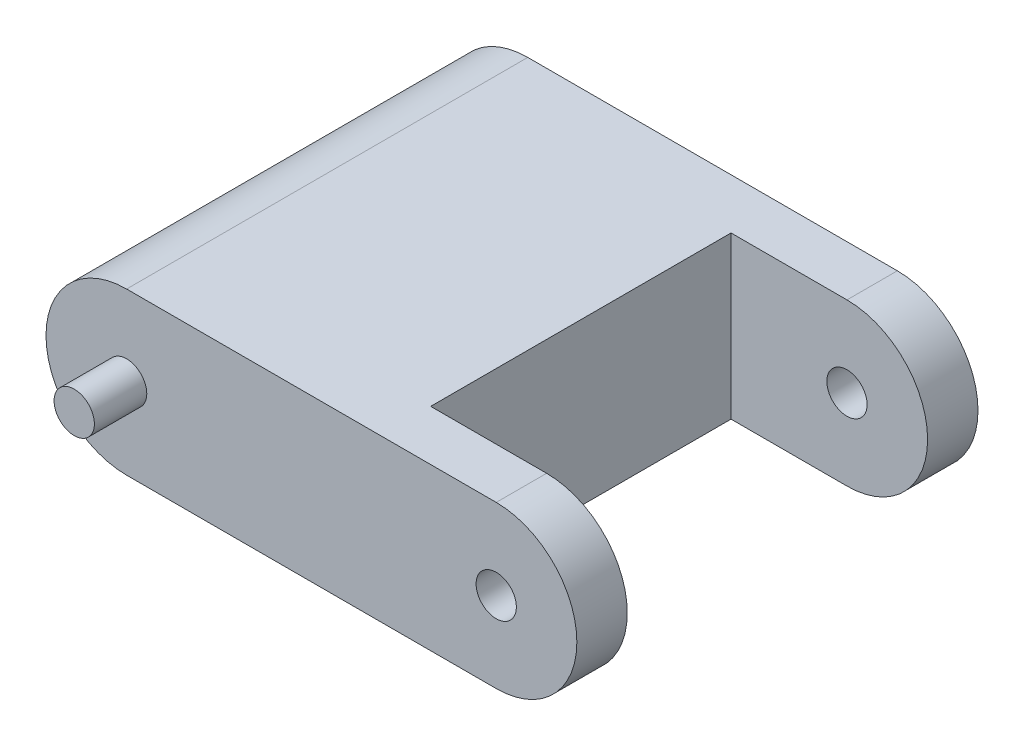
ISO-10303-21;
HEADER;
FILE_DESCRIPTION(('STEP AP214'),'2;1');
FILE_NAME('part.step','',(''),(''),'','','');
FILE_SCHEMA(('AUTOMOTIVE_DESIGN { 1 0 10303 214 1 1 1 1 }'));
ENDSEC;
DATA;
#1=APPLICATION_CONTEXT('core data for automotive mechanical design processes');
#2=APPLICATION_PROTOCOL_DEFINITION('international standard','automotive_design',2000,#1);
#3=PRODUCT_CONTEXT('',#1,'mechanical');
#4=PRODUCT('Part','Part','',(#3));
#5=PRODUCT_RELATED_PRODUCT_CATEGORY('part','',(#4));
#6=PRODUCT_DEFINITION_FORMATION('','',#4);
#7=PRODUCT_DEFINITION_CONTEXT('part definition',#1,'design');
#8=PRODUCT_DEFINITION('design','',#6,#7);
#9=PRODUCT_DEFINITION_SHAPE('','',#8);
#10=(LENGTH_UNIT() NAMED_UNIT(*) SI_UNIT(.MILLI.,.METRE.));
#11=(NAMED_UNIT(*) PLANE_ANGLE_UNIT() SI_UNIT($,.RADIAN.));
#12=(NAMED_UNIT(*) SI_UNIT($,.STERADIAN.) SOLID_ANGLE_UNIT());
#13=UNCERTAINTY_MEASURE_WITH_UNIT(LENGTH_MEASURE(1.E-05),#10,'distance_accuracy_value','');
#14=(GEOMETRIC_REPRESENTATION_CONTEXT(3) GLOBAL_UNCERTAINTY_ASSIGNED_CONTEXT((#13)) GLOBAL_UNIT_ASSIGNED_CONTEXT((#10,
#11,#12)) REPRESENTATION_CONTEXT('',''));
#15=CARTESIAN_POINT('',(0.,0.,0.));
#16=DIRECTION('',(0.,0.,1.));
#17=DIRECTION('',(1.,0.,0.));
#18=AXIS2_PLACEMENT_3D('',#15,#16,#17);
#19=CARTESIAN_POINT('',(183.351967945851,0.,199.));
#20=DIRECTION('',(0.,0.,-1.));
#21=DIRECTION('',(-1.,0.,0.));
#22=AXIS2_PLACEMENT_3D('',#19,#20,#21);
#23=CYLINDRICAL_SURFACE('',#22,40.);
#24=DIRECTION('',(0.,0.,-1.));
#25=VECTOR('',#24,1.);
#26=CARTESIAN_POINT('',(183.351967945851,-40.,199.));
#27=LINE('',#26,#25);
#28=CARTESIAN_POINT('',(183.351967945851,-40.,199.));
#29=VERTEX_POINT('',#28);
#30=CARTESIAN_POINT('',(183.351967945851,-40.,174.));
#31=VERTEX_POINT('',#30);
#32=EDGE_CURVE('E178',#29,#31,#27,.T.);
#33=ORIENTED_EDGE('',*,*,#32,.T.);
#34=CARTESIAN_POINT('',(183.351967945851,0.,174.));
#35=DIRECTION('',(0.,0.,1.));
#36=DIRECTION('',(1.,0.,0.));
#37=AXIS2_PLACEMENT_3D('',#34,#35,#36);
#38=CIRCLE('',#37,40.);
#39=CARTESIAN_POINT('',(183.351967945851,40.,174.));
#40=VERTEX_POINT('',#39);
#41=EDGE_CURVE('E136',#31,#40,#38,.T.);
#42=ORIENTED_EDGE('',*,*,#41,.T.);
#43=DIRECTION('',(0.,0.,-1.));
#44=VECTOR('',#43,1.);
#45=CARTESIAN_POINT('',(183.351967945851,40.,199.));
#46=LINE('',#45,#44);
#47=CARTESIAN_POINT('',(183.351967945851,40.,199.));
#48=VERTEX_POINT('',#47);
#49=EDGE_CURVE('E175',#48,#40,#46,.T.);
#50=ORIENTED_EDGE('',*,*,#49,.F.);
#51=CARTESIAN_POINT('',(183.351967945851,0.,199.));
#52=DIRECTION('',(0.,0.,1.));
#53=DIRECTION('',(1.,0.,0.));
#54=AXIS2_PLACEMENT_3D('',#51,#52,#53);
#55=CIRCLE('',#54,40.);
#56=EDGE_CURVE('E160',#29,#48,#55,.T.);
#57=ORIENTED_EDGE('',*,*,#56,.F.);
#58=EDGE_LOOP('',(#33,#42,#50,#57));
#59=FACE_BOUND('',#58,.T.);
#60=ADVANCED_FACE('F33',(#59),#23,.T.);
#61=CARTESIAN_POINT('',(183.351967945851,0.,240.));
#62=DIRECTION('',(0.,0.,-1.));
#63=DIRECTION('',(-1.,0.,0.));
#64=AXIS2_PLACEMENT_3D('',#61,#62,#63);
#65=CYLINDRICAL_SURFACE('',#64,9.98799999999999);
#66=CARTESIAN_POINT('',(183.351967945851,0.,174.));
#67=DIRECTION('',(0.,0.,1.));
#68=DIRECTION('',(1.,0.,0.));
#69=AXIS2_PLACEMENT_3D('',#66,#67,#68);
#70=CIRCLE('',#69,9.98799999999999);
#71=CARTESIAN_POINT('',(193.339967945851,0.,174.));
#72=VERTEX_POINT('',#71);
#73=EDGE_CURVE('E37',#72,#72,#70,.F.);
#74=ORIENTED_EDGE('',*,*,#73,.T.);
#75=EDGE_LOOP('',(#74));
#76=FACE_BOUND('',#75,.T.);
#77=CARTESIAN_POINT('',(183.351967945851,0.,199.));
#78=DIRECTION('',(0.,0.,1.));
#79=DIRECTION('',(1.,0.,0.));
#80=AXIS2_PLACEMENT_3D('',#77,#78,#79);
#81=CIRCLE('',#80,9.98799999999999);
#82=CARTESIAN_POINT('',(193.339967945851,0.,199.));
#83=VERTEX_POINT('',#82);
#84=EDGE_CURVE('E153',#83,#83,#81,.T.);
#85=ORIENTED_EDGE('',*,*,#84,.T.);
#86=EDGE_LOOP('',(#85));
#87=FACE_BOUND('',#86,.T.);
#88=ADVANCED_FACE('F200',(#76,#87),#65,.F.);
#89=CARTESIAN_POINT('',(0.,0.,199.));
#90=DIRECTION('',(0.,0.,-1.));
#91=DIRECTION('',(-1.,0.,0.));
#92=AXIS2_PLACEMENT_3D('',#89,#90,#91);
#93=CYLINDRICAL_SURFACE('',#92,40.);
#94=CARTESIAN_POINT('',(0.,0.,0.));
#95=DIRECTION('',(0.,0.,1.));
#96=DIRECTION('',(1.,0.,0.));
#97=AXIS2_PLACEMENT_3D('',#94,#95,#96);
#98=CIRCLE('',#97,40.);
#99=CARTESIAN_POINT('',(0.,40.,0.));
#100=VERTEX_POINT('',#99);
#101=CARTESIAN_POINT('',(0.,-40.,0.));
#102=VERTEX_POINT('',#101);
#103=EDGE_CURVE('E156',#100,#102,#98,.T.);
#104=ORIENTED_EDGE('',*,*,#103,.T.);
#105=DIRECTION('',(0.,0.,-1.));
#106=VECTOR('',#105,1.);
#107=CARTESIAN_POINT('',(0.,-40.,199.));
#108=LINE('',#107,#106);
#109=CARTESIAN_POINT('',(0.,-40.,199.));
#110=VERTEX_POINT('',#109);
#111=EDGE_CURVE('E42',#110,#102,#108,.T.);
#112=ORIENTED_EDGE('',*,*,#111,.F.);
#113=CARTESIAN_POINT('',(0.,0.,199.));
#114=DIRECTION('',(0.,0.,1.));
#115=DIRECTION('',(1.,0.,0.));
#116=AXIS2_PLACEMENT_3D('',#113,#114,#115);
#117=CIRCLE('',#116,40.);
#118=CARTESIAN_POINT('',(0.,40.,199.));
#119=VERTEX_POINT('',#118);
#120=EDGE_CURVE('E157',#119,#110,#117,.T.);
#121=ORIENTED_EDGE('',*,*,#120,.F.);
#122=DIRECTION('',(0.,0.,-1.));
#123=VECTOR('',#122,1.);
#124=CARTESIAN_POINT('',(0.,40.,199.));
#125=LINE('',#124,#123);
#126=EDGE_CURVE('E163',#119,#100,#125,.T.);
#127=ORIENTED_EDGE('',*,*,#126,.T.);
#128=EDGE_LOOP('',(#104,#112,#121,#127));
#129=FACE_BOUND('',#128,.T.);
#130=ADVANCED_FACE('F35',(#129),#93,.T.);
#131=CARTESIAN_POINT('',(0.,-40.,199.));
#132=DIRECTION('',(0.,1.,0.));
#133=DIRECTION('',(0.,0.,1.));
#134=AXIS2_PLACEMENT_3D('',#131,#132,#133);
#135=PLANE('',#134);
#136=DIRECTION('',(0.,0.,1.));
#137=VECTOR('',#136,1.);
#138=CARTESIAN_POINT('',(125.83524238696,-40.,199.));
#139=LINE('',#138,#137);
#140=CARTESIAN_POINT('',(125.83524238696,-40.,25.));
#141=VERTEX_POINT('',#140);
#142=CARTESIAN_POINT('',(125.83524238696,-40.,174.));
#143=VERTEX_POINT('',#142);
#144=EDGE_CURVE('E117',#141,#143,#139,.T.);
#145=ORIENTED_EDGE('',*,*,#144,.T.);
#146=DIRECTION('',(1.,0.,0.));
#147=VECTOR('',#146,1.);
#148=CARTESIAN_POINT('',(0.,-40.,174.));
#149=LINE('',#148,#147);
#150=EDGE_CURVE('E139',#143,#31,#149,.T.);
#151=ORIENTED_EDGE('',*,*,#150,.T.);
#152=ORIENTED_EDGE('',*,*,#32,.F.);
#153=DIRECTION('',(1.,0.,0.));
#154=VECTOR('',#153,1.);
#155=CARTESIAN_POINT('',(0.,-40.,199.));
#156=LINE('',#155,#154);
#157=EDGE_CURVE('E87',#110,#29,#156,.T.);
#158=ORIENTED_EDGE('',*,*,#157,.F.);
#159=ORIENTED_EDGE('',*,*,#111,.T.);
#160=DIRECTION('',(1.,0.,0.));
#161=VECTOR('',#160,1.);
#162=CARTESIAN_POINT('',(0.,-40.,0.));
#163=LINE('',#162,#161);
#164=CARTESIAN_POINT('',(183.351967945851,-40.,0.));
#165=VERTEX_POINT('',#164);
#166=EDGE_CURVE('E166',#102,#165,#163,.T.);
#167=ORIENTED_EDGE('',*,*,#166,.T.);
#168=CARTESIAN_POINT('',(183.351967945851,-40.,25.));
#169=VERTEX_POINT('',#168);
#170=EDGE_CURVE('E177',#169,#165,#27,.T.);
#171=ORIENTED_EDGE('',*,*,#170,.F.);
#172=DIRECTION('',(-1.,0.,0.));
#173=VECTOR('',#172,1.);
#174=CARTESIAN_POINT('',(0.,-40.,25.));
#175=LINE('',#174,#173);
#176=EDGE_CURVE('E134',#169,#141,#175,.T.);
#177=ORIENTED_EDGE('',*,*,#176,.T.);
#178=EDGE_LOOP('',(#145,#151,#152,#158,#159,#167,#171,#177));
#179=FACE_BOUND('',#178,.T.);
#180=ADVANCED_FACE('F211',(#179),#135,.F.);
#181=CARTESIAN_POINT('',(183.351967945851,40.,25.));
#182=VERTEX_POINT('',#181);
#183=CARTESIAN_POINT('',(183.351967945851,40.,0.));
#184=VERTEX_POINT('',#183);
#185=EDGE_CURVE('E174',#182,#184,#46,.T.);
#186=ORIENTED_EDGE('',*,*,#185,.F.);
#187=CARTESIAN_POINT('',(183.351967945851,0.,25.));
#188=DIRECTION('',(0.,0.,-1.));
#189=DIRECTION('',(-1.,0.,0.));
#190=AXIS2_PLACEMENT_3D('',#187,#188,#189);
#191=CIRCLE('',#190,40.);
#192=EDGE_CURVE('E50',#182,#169,#191,.T.);
#193=ORIENTED_EDGE('',*,*,#192,.T.);
#194=ORIENTED_EDGE('',*,*,#170,.T.);
#195=CARTESIAN_POINT('',(183.351967945851,0.,0.));
#196=DIRECTION('',(0.,0.,1.));
#197=DIRECTION('',(1.,0.,0.));
#198=AXIS2_PLACEMENT_3D('',#195,#196,#197);
#199=CIRCLE('',#198,40.);
#200=EDGE_CURVE('E169',#165,#184,#199,.T.);
#201=ORIENTED_EDGE('',*,*,#200,.T.);
#202=EDGE_LOOP('',(#186,#193,#194,#201));
#203=FACE_BOUND('',#202,.T.);
#204=ADVANCED_FACE('F203',(#203),#23,.T.);
#205=CARTESIAN_POINT('',(0.,40.,199.));
#206=DIRECTION('',(0.,-1.,0.));
#207=DIRECTION('',(0.,0.,-1.));
#208=AXIS2_PLACEMENT_3D('',#205,#206,#207);
#209=PLANE('',#208);
#210=ORIENTED_EDGE('',*,*,#49,.T.);
#211=DIRECTION('',(1.,0.,0.));
#212=VECTOR('',#211,1.);
#213=CARTESIAN_POINT('',(249.482135519451,40.,174.));
#214=LINE('',#213,#212);
#215=CARTESIAN_POINT('',(125.83524238696,40.,174.));
#216=VERTEX_POINT('',#215);
#217=EDGE_CURVE('E120',#216,#40,#214,.T.);
#218=ORIENTED_EDGE('',*,*,#217,.F.);
#219=DIRECTION('',(0.,0.,1.));
#220=VECTOR('',#219,1.);
#221=CARTESIAN_POINT('',(125.83524238696,40.,25.));
#222=LINE('',#221,#220);
#223=CARTESIAN_POINT('',(125.83524238696,40.,25.));
#224=VERTEX_POINT('',#223);
#225=EDGE_CURVE('E114',#224,#216,#222,.T.);
#226=ORIENTED_EDGE('',*,*,#225,.F.);
#227=DIRECTION('',(-1.,0.,0.));
#228=VECTOR('',#227,1.);
#229=CARTESIAN_POINT('',(249.482135519451,40.,25.));
#230=LINE('',#229,#228);
#231=EDGE_CURVE('E122',#182,#224,#230,.T.);
#232=ORIENTED_EDGE('',*,*,#231,.F.);
#233=ORIENTED_EDGE('',*,*,#185,.T.);
#234=DIRECTION('',(-1.,0.,0.));
#235=VECTOR('',#234,1.);
#236=CARTESIAN_POINT('',(0.,40.,0.));
#237=LINE('',#236,#235);
#238=EDGE_CURVE('E79',#184,#100,#237,.T.);
#239=ORIENTED_EDGE('',*,*,#238,.T.);
#240=ORIENTED_EDGE('',*,*,#126,.F.);
#241=DIRECTION('',(-1.,0.,0.));
#242=VECTOR('',#241,1.);
#243=CARTESIAN_POINT('',(0.,40.,199.));
#244=LINE('',#243,#242);
#245=EDGE_CURVE('E59',#48,#119,#244,.T.);
#246=ORIENTED_EDGE('',*,*,#245,.F.);
#247=EDGE_LOOP('',(#210,#218,#226,#232,#233,#239,#240,#246));
#248=FACE_BOUND('',#247,.T.);
#249=ADVANCED_FACE('F127',(#248),#209,.F.);
#250=CARTESIAN_POINT('',(0.,0.,199.));
#251=DIRECTION('',(0.,0.,1.));
#252=DIRECTION('',(1.,0.,0.));
#253=AXIS2_PLACEMENT_3D('',#250,#251,#252);
#254=PLANE('',#253);
#255=CARTESIAN_POINT('',(0.,0.,199.));
#256=DIRECTION('',(0.,0.,1.));
#257=DIRECTION('',(1.,0.,0.));
#258=AXIS2_PLACEMENT_3D('',#255,#256,#257);
#259=CIRCLE('',#258,10.);
#260=CARTESIAN_POINT('',(10.,0.,199.));
#261=VERTEX_POINT('',#260);
#262=EDGE_CURVE('E11',#261,#261,#259,.T.);
#263=ORIENTED_EDGE('',*,*,#262,.F.);
#264=EDGE_LOOP('',(#263));
#265=FACE_BOUND('',#264,.T.);
#266=ORIENTED_EDGE('',*,*,#84,.F.);
#267=EDGE_LOOP('',(#266));
#268=FACE_BOUND('',#267,.T.);
#269=ORIENTED_EDGE('',*,*,#120,.T.);
#270=ORIENTED_EDGE('',*,*,#157,.T.);
#271=ORIENTED_EDGE('',*,*,#56,.T.);
#272=ORIENTED_EDGE('',*,*,#245,.T.);
#273=EDGE_LOOP('',(#269,#270,#271,#272));
#274=FACE_BOUND('',#273,.T.);
#275=ADVANCED_FACE('F217',(#265,#268,#274),#254,.T.);
#276=CARTESIAN_POINT('',(0.,0.,0.));
#277=DIRECTION('',(0.,0.,1.));
#278=DIRECTION('',(1.,0.,0.));
#279=AXIS2_PLACEMENT_3D('',#276,#277,#278);
#280=PLANE('',#279);
#281=CARTESIAN_POINT('',(0.,0.,0.));
#282=DIRECTION('',(0.,0.,1.));
#283=DIRECTION('',(1.,0.,0.));
#284=AXIS2_PLACEMENT_3D('',#281,#282,#283);
#285=CIRCLE('',#284,10.);
#286=CARTESIAN_POINT('',(10.,0.,0.));
#287=VERTEX_POINT('',#286);
#288=EDGE_CURVE('E148',#287,#287,#285,.T.);
#289=ORIENTED_EDGE('',*,*,#288,.T.);
#290=EDGE_LOOP('',(#289));
#291=FACE_BOUND('',#290,.T.);
#292=CARTESIAN_POINT('',(183.351967945851,0.,0.));
#293=DIRECTION('',(0.,0.,-1.));
#294=DIRECTION('',(-1.,0.,0.));
#295=AXIS2_PLACEMENT_3D('',#292,#293,#294);
#296=CIRCLE('',#295,9.98799999999999);
#297=CARTESIAN_POINT('',(173.363967945851,0.,0.));
#298=VERTEX_POINT('',#297);
#299=EDGE_CURVE('E150',#298,#298,#296,.T.);
#300=ORIENTED_EDGE('',*,*,#299,.F.);
#301=EDGE_LOOP('',(#300));
#302=FACE_BOUND('',#301,.T.);
#303=ORIENTED_EDGE('',*,*,#103,.F.);
#304=ORIENTED_EDGE('',*,*,#238,.F.);
#305=ORIENTED_EDGE('',*,*,#200,.F.);
#306=ORIENTED_EDGE('',*,*,#166,.F.);
#307=EDGE_LOOP('',(#303,#304,#305,#306));
#308=FACE_BOUND('',#307,.T.);
#309=ADVANCED_FACE('F222',(#291,#302,#308),#280,.F.);
#310=CARTESIAN_POINT('',(183.351967945851,0.,25.));
#311=DIRECTION('',(0.,0.,-1.));
#312=DIRECTION('',(-1.,0.,0.));
#313=AXIS2_PLACEMENT_3D('',#310,#311,#312);
#314=CIRCLE('',#313,9.98799999999999);
#315=CARTESIAN_POINT('',(173.363967945851,0.,25.));
#316=VERTEX_POINT('',#315);
#317=EDGE_CURVE('E131',#316,#316,#314,.F.);
#318=ORIENTED_EDGE('',*,*,#317,.T.);
#319=EDGE_LOOP('',(#318));
#320=FACE_BOUND('',#319,.T.);
#321=ORIENTED_EDGE('',*,*,#299,.T.);
#322=EDGE_LOOP('',(#321));
#323=FACE_BOUND('',#322,.T.);
#324=ADVANCED_FACE('F186',(#320,#323),#65,.F.);
#325=CARTESIAN_POINT('',(0.,0.,-26.0000000000002));
#326=DIRECTION('',(0.,0.,1.));
#327=DIRECTION('',(1.,0.,0.));
#328=AXIS2_PLACEMENT_3D('',#325,#326,#327);
#329=PLANE('',#328);
#330=CARTESIAN_POINT('',(0.,0.,-26.0000000000002));
#331=DIRECTION('',(0.,0.,1.));
#332=DIRECTION('',(1.,0.,0.));
#333=AXIS2_PLACEMENT_3D('',#330,#331,#332);
#334=CIRCLE('',#333,10.);
#335=CARTESIAN_POINT('',(10.,0.,-26.0000000000002));
#336=VERTEX_POINT('',#335);
#337=EDGE_CURVE('E146',#336,#336,#334,.T.);
#338=ORIENTED_EDGE('',*,*,#337,.F.);
#339=EDGE_LOOP('',(#338));
#340=FACE_BOUND('',#339,.T.);
#341=ADVANCED_FACE('F241',(#340),#329,.F.);
#342=CARTESIAN_POINT('',(0.,0.,-26.0000000000002));
#343=DIRECTION('',(0.,0.,1.));
#344=DIRECTION('',(1.,0.,0.));
#345=AXIS2_PLACEMENT_3D('',#342,#343,#344);
#346=CYLINDRICAL_SURFACE('',#345,10.);
#347=ORIENTED_EDGE('',*,*,#337,.T.);
#348=EDGE_LOOP('',(#347));
#349=FACE_BOUND('',#348,.T.);
#350=ORIENTED_EDGE('',*,*,#288,.F.);
#351=EDGE_LOOP('',(#350));
#352=FACE_BOUND('',#351,.T.);
#353=ADVANCED_FACE('F246',(#349,#352),#346,.T.);
#354=ORIENTED_EDGE('',*,*,#262,.T.);
#355=EDGE_LOOP('',(#354));
#356=FACE_BOUND('',#355,.T.);
#357=CARTESIAN_POINT('',(0.,0.,225.));
#358=DIRECTION('',(0.,0.,1.));
#359=DIRECTION('',(1.,0.,0.));
#360=AXIS2_PLACEMENT_3D('',#357,#358,#359);
#361=CIRCLE('',#360,10.);
#362=CARTESIAN_POINT('',(10.,0.,225.));
#363=VERTEX_POINT('',#362);
#364=EDGE_CURVE('E143',#363,#363,#361,.T.);
#365=ORIENTED_EDGE('',*,*,#364,.F.);
#366=EDGE_LOOP('',(#365));
#367=FACE_BOUND('',#366,.T.);
#368=ADVANCED_FACE('F242',(#356,#367),#346,.T.);
#369=CARTESIAN_POINT('',(0.,0.,225.));
#370=DIRECTION('',(0.,0.,1.));
#371=DIRECTION('',(1.,0.,0.));
#372=AXIS2_PLACEMENT_3D('',#369,#370,#371);
#373=PLANE('',#372);
#374=ORIENTED_EDGE('',*,*,#364,.T.);
#375=EDGE_LOOP('',(#374));
#376=FACE_BOUND('',#375,.T.);
#377=ADVANCED_FACE('F245',(#376),#373,.T.);
#378=CARTESIAN_POINT('',(125.83524238696,-82.,25.));
#379=DIRECTION('',(-1.,0.,0.));
#380=DIRECTION('',(0.,0.,1.));
#381=AXIS2_PLACEMENT_3D('',#378,#379,#380);
#382=PLANE('',#381);
#383=DIRECTION('',(0.,1.,0.));
#384=VECTOR('',#383,1.);
#385=CARTESIAN_POINT('',(125.83524238696,-82.,25.));
#386=LINE('',#385,#384);
#387=EDGE_CURVE('E110',#141,#224,#386,.T.);
#388=ORIENTED_EDGE('',*,*,#387,.T.);
#389=ORIENTED_EDGE('',*,*,#225,.T.);
#390=DIRECTION('',(0.,1.,0.));
#391=VECTOR('',#390,1.);
#392=CARTESIAN_POINT('',(125.83524238696,-82.,174.));
#393=LINE('',#392,#391);
#394=EDGE_CURVE('E119',#143,#216,#393,.T.);
#395=ORIENTED_EDGE('',*,*,#394,.F.);
#396=ORIENTED_EDGE('',*,*,#144,.F.);
#397=EDGE_LOOP('',(#388,#389,#395,#396));
#398=FACE_BOUND('',#397,.T.);
#399=ADVANCED_FACE('F111',(#398),#382,.F.);
#400=CARTESIAN_POINT('',(249.482135519451,-82.,174.));
#401=DIRECTION('',(0.,0.,1.));
#402=DIRECTION('',(1.,0.,0.));
#403=AXIS2_PLACEMENT_3D('',#400,#401,#402);
#404=PLANE('',#403);
#405=ORIENTED_EDGE('',*,*,#73,.F.);
#406=EDGE_LOOP('',(#405));
#407=FACE_BOUND('',#406,.T.);
#408=ORIENTED_EDGE('',*,*,#394,.T.);
#409=ORIENTED_EDGE('',*,*,#217,.T.);
#410=ORIENTED_EDGE('',*,*,#41,.F.);
#411=ORIENTED_EDGE('',*,*,#150,.F.);
#412=EDGE_LOOP('',(#408,#409,#410,#411));
#413=FACE_BOUND('',#412,.T.);
#414=ADVANCED_FACE('F190',(#407,#413),#404,.F.);
#415=CARTESIAN_POINT('',(249.482135519451,-82.,25.));
#416=DIRECTION('',(0.,0.,-1.));
#417=DIRECTION('',(-1.,0.,0.));
#418=AXIS2_PLACEMENT_3D('',#415,#416,#417);
#419=PLANE('',#418);
#420=ORIENTED_EDGE('',*,*,#317,.F.);
#421=EDGE_LOOP('',(#420));
#422=FACE_BOUND('',#421,.T.);
#423=ORIENTED_EDGE('',*,*,#192,.F.);
#424=ORIENTED_EDGE('',*,*,#231,.T.);
#425=ORIENTED_EDGE('',*,*,#387,.F.);
#426=ORIENTED_EDGE('',*,*,#176,.F.);
#427=EDGE_LOOP('',(#423,#424,#425,#426));
#428=FACE_BOUND('',#427,.T.);
#429=ADVANCED_FACE('F123',(#422,#428),#419,.F.);
#430=CLOSED_SHELL('',(#60,#88,#130,#180,#204,#249,#275,#309,#324,#341,#353,#368,#377,#399,#414,#429));
#431=MANIFOLD_SOLID_BREP('B2',#430);
#432=ADVANCED_BREP_SHAPE_REPRESENTATION('',(#18,#431),#14);
#433=SHAPE_DEFINITION_REPRESENTATION(#9,#432);
ENDSEC;
END-ISO-10303-21;
